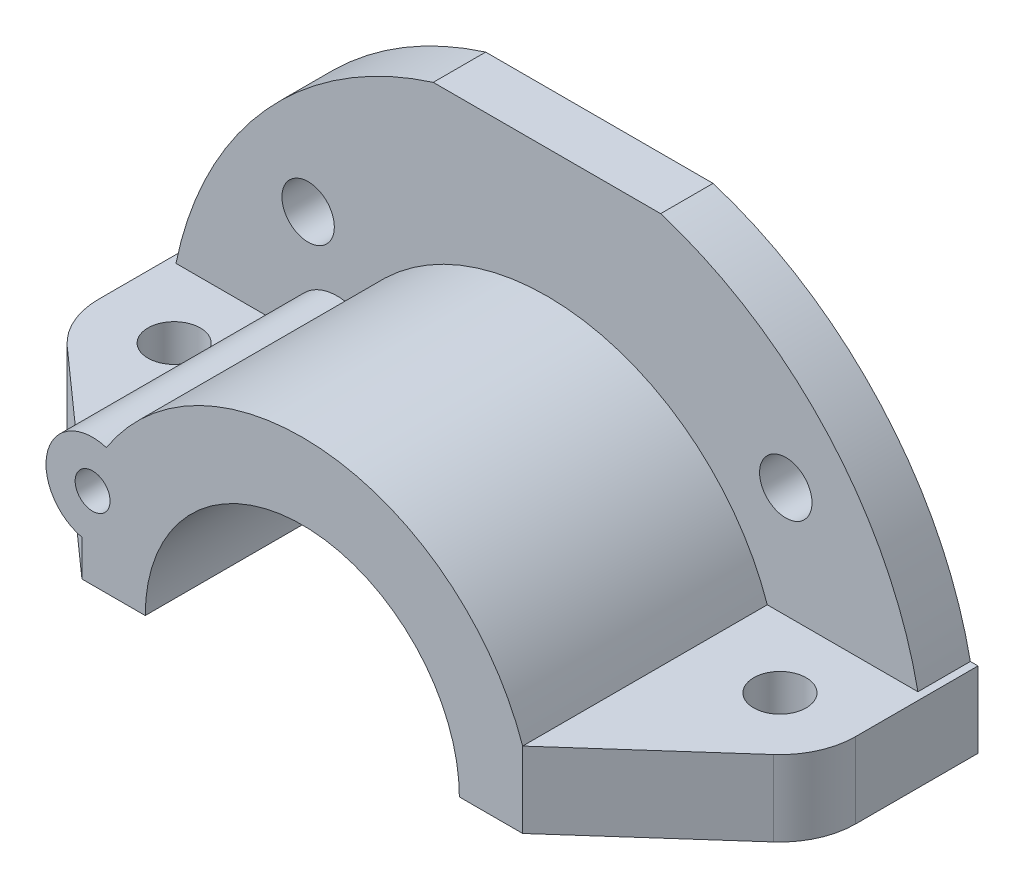
ISO-10303-21;
HEADER;
FILE_DESCRIPTION(('STEP AP214'),'2;1');
FILE_NAME('part.step','',(''),(''),'','','');
FILE_SCHEMA(('AUTOMOTIVE_DESIGN { 1 0 10303 214 1 1 1 1 }'));
ENDSEC;
DATA;
#1=APPLICATION_CONTEXT('core data for automotive mechanical design processes');
#2=APPLICATION_PROTOCOL_DEFINITION('international standard','automotive_design',2000,#1);
#3=PRODUCT_CONTEXT('',#1,'mechanical');
#4=PRODUCT('Part','Part','',(#3));
#5=PRODUCT_RELATED_PRODUCT_CATEGORY('part','',(#4));
#6=PRODUCT_DEFINITION_FORMATION('','',#4);
#7=PRODUCT_DEFINITION_CONTEXT('part definition',#1,'design');
#8=PRODUCT_DEFINITION('design','',#6,#7);
#9=PRODUCT_DEFINITION_SHAPE('','',#8);
#10=(LENGTH_UNIT() NAMED_UNIT(*) SI_UNIT(.MILLI.,.METRE.));
#11=(NAMED_UNIT(*) PLANE_ANGLE_UNIT() SI_UNIT($,.RADIAN.));
#12=(NAMED_UNIT(*) SI_UNIT($,.STERADIAN.) SOLID_ANGLE_UNIT());
#13=UNCERTAINTY_MEASURE_WITH_UNIT(LENGTH_MEASURE(1.E-05),#10,'distance_accuracy_value','');
#14=(GEOMETRIC_REPRESENTATION_CONTEXT(3) GLOBAL_UNCERTAINTY_ASSIGNED_CONTEXT((#13)) GLOBAL_UNIT_ASSIGNED_CONTEXT((#10,
#11,#12)) REPRESENTATION_CONTEXT('',''));
#15=CARTESIAN_POINT('',(0.,0.,0.));
#16=DIRECTION('',(0.,0.,1.));
#17=DIRECTION('',(1.,0.,0.));
#18=AXIS2_PLACEMENT_3D('',#15,#16,#17);
#19=CARTESIAN_POINT('',(-65.,0.,51.));
#20=DIRECTION('',(1.,0.,0.));
#21=DIRECTION('',(0.,1.,0.));
#22=AXIS2_PLACEMENT_3D('',#19,#20,#21);
#23=PLANE('',#22);
#24=DIRECTION('',(0.,1.,0.));
#25=VECTOR('',#24,1.);
#26=CARTESIAN_POINT('',(-65.,-0.00100000000003223,21.));
#27=LINE('',#26,#25);
#28=CARTESIAN_POINT('',(-65.,0.,21.));
#29=VERTEX_POINT('',#28);
#30=CARTESIAN_POINT('',(-65.,13.,21.));
#31=VERTEX_POINT('',#30);
#32=EDGE_CURVE('E167',#29,#31,#27,.T.);
#33=ORIENTED_EDGE('',*,*,#32,.T.);
#34=DIRECTION('',(0.,0.,-1.));
#35=VECTOR('',#34,1.);
#36=CARTESIAN_POINT('',(-65.,13.,51.));
#37=LINE('',#36,#35);
#38=CARTESIAN_POINT('',(-65.,13.,0.));
#39=VERTEX_POINT('',#38);
#40=EDGE_CURVE('E195',#31,#39,#37,.T.);
#41=ORIENTED_EDGE('',*,*,#40,.T.);
#42=DIRECTION('',(0.,-1.,0.));
#43=VECTOR('',#42,1.);
#44=CARTESIAN_POINT('',(-65.,0.,0.));
#45=LINE('',#44,#43);
#46=CARTESIAN_POINT('',(-65.,0.,0.));
#47=VERTEX_POINT('',#46);
#48=EDGE_CURVE('E193',#39,#47,#45,.T.);
#49=ORIENTED_EDGE('',*,*,#48,.T.);
#50=DIRECTION('',(0.,0.,-1.));
#51=VECTOR('',#50,1.);
#52=CARTESIAN_POINT('',(-65.,0.,51.));
#53=LINE('',#52,#51);
#54=EDGE_CURVE('E184',#29,#47,#53,.T.);
#55=ORIENTED_EDGE('',*,*,#54,.F.);
#56=EDGE_LOOP('',(#33,#41,#49,#55));
#57=FACE_BOUND('',#56,.T.);
#58=ADVANCED_FACE('F47',(#57),#23,.F.);
#59=CARTESIAN_POINT('',(65.,0.,51.));
#60=DIRECTION('',(1.,0.,0.));
#61=DIRECTION('',(0.,1.,0.));
#62=AXIS2_PLACEMENT_3D('',#59,#60,#61);
#63=PLANE('',#62);
#64=DIRECTION('',(0.,0.,-1.));
#65=VECTOR('',#64,1.);
#66=CARTESIAN_POINT('',(65.,13.,51.));
#67=LINE('',#66,#65);
#68=CARTESIAN_POINT('',(65.,13.,21.));
#69=VERTEX_POINT('',#68);
#70=CARTESIAN_POINT('',(65.,13.,0.));
#71=VERTEX_POINT('',#70);
#72=EDGE_CURVE('E254',#69,#71,#67,.T.);
#73=ORIENTED_EDGE('',*,*,#72,.F.);
#74=DIRECTION('',(0.,1.,0.));
#75=VECTOR('',#74,1.);
#76=CARTESIAN_POINT('',(65.,-0.00100000000001488,21.));
#77=LINE('',#76,#75);
#78=CARTESIAN_POINT('',(65.,0.,21.));
#79=VERTEX_POINT('',#78);
#80=EDGE_CURVE('E350',#79,#69,#77,.T.);
#81=ORIENTED_EDGE('',*,*,#80,.F.);
#82=DIRECTION('',(0.,0.,-1.));
#83=VECTOR('',#82,1.);
#84=CARTESIAN_POINT('',(65.,0.,51.));
#85=LINE('',#84,#83);
#86=CARTESIAN_POINT('',(65.,0.,0.));
#87=VERTEX_POINT('',#86);
#88=EDGE_CURVE('E251',#79,#87,#85,.T.);
#89=ORIENTED_EDGE('',*,*,#88,.T.);
#90=DIRECTION('',(0.,-1.,0.));
#91=VECTOR('',#90,1.);
#92=CARTESIAN_POINT('',(65.,0.,0.));
#93=LINE('',#92,#91);
#94=EDGE_CURVE('E245',#71,#87,#93,.T.);
#95=ORIENTED_EDGE('',*,*,#94,.F.);
#96=EDGE_LOOP('',(#73,#81,#89,#95));
#97=FACE_BOUND('',#96,.T.);
#98=ADVANCED_FACE('F438',(#97),#63,.T.);
#99=CARTESIAN_POINT('',(0.,13.,51.));
#100=DIRECTION('',(0.,1.,0.));
#101=DIRECTION('',(-1.,0.,0.));
#102=AXIS2_PLACEMENT_3D('',#99,#100,#101);
#103=PLANE('',#102);
#104=DIRECTION('',(0.,0.,1.));
#105=VECTOR('',#104,1.);
#106=CARTESIAN_POINT('',(-43.9372539331938,13.,-13.6274169979695));
#107=LINE('',#106,#105);
#108=CARTESIAN_POINT('',(-43.9372539331938,13.,9.));
#109=VERTEX_POINT('',#108);
#110=CARTESIAN_POINT('',(-43.9372539331938,13.,45.5674390370028));
#111=VERTEX_POINT('',#110);
#112=EDGE_CURVE('E71',#109,#111,#107,.T.);
#113=ORIENTED_EDGE('',*,*,#112,.F.);
#114=DIRECTION('',(1.,0.,0.));
#115=VECTOR('',#114,1.);
#116=CARTESIAN_POINT('',(0.,13.,9.));
#117=LINE('',#116,#115);
#118=CARTESIAN_POINT('',(-63.6867333123626,13.,9.));
#119=VERTEX_POINT('',#118);
#120=EDGE_CURVE('E315',#119,#109,#117,.T.);
#121=ORIENTED_EDGE('',*,*,#120,.F.);
#122=DIRECTION('',(0.,0.,-1.));
#123=VECTOR('',#122,1.);
#124=CARTESIAN_POINT('',(-63.6867333123626,13.,9.));
#125=LINE('',#124,#123);
#126=CARTESIAN_POINT('',(-63.6867333123626,13.,0.));
#127=VERTEX_POINT('',#126);
#128=EDGE_CURVE('E283',#119,#127,#125,.T.);
#129=ORIENTED_EDGE('',*,*,#128,.T.);
#130=DIRECTION('',(1.,0.,0.));
#131=VECTOR('',#130,1.);
#132=CARTESIAN_POINT('',(0.,13.,0.));
#133=LINE('',#132,#131);
#134=EDGE_CURVE('E201',#39,#127,#133,.T.);
#135=ORIENTED_EDGE('',*,*,#134,.F.);
#136=ORIENTED_EDGE('',*,*,#40,.F.);
#137=CARTESIAN_POINT('',(-52.,13.,21.));
#138=DIRECTION('',(0.,-1.,0.));
#139=DIRECTION('',(1.,0.,0.));
#140=AXIS2_PLACEMENT_3D('',#137,#138,#139);
#141=CIRCLE('',#140,13.);
#142=CARTESIAN_POINT('',(-60.6390494366874,13.,30.714258841027));
#143=VERTEX_POINT('',#142);
#144=EDGE_CURVE('E174',#143,#31,#141,.T.);
#145=ORIENTED_EDGE('',*,*,#144,.F.);
#146=DIRECTION('',(-0.747250680078999,0.,-0.66454226436057));
#147=VECTOR('',#146,1.);
#148=CARTESIAN_POINT('',(-37.8285606387555,13.,51.));
#149=LINE('',#148,#147);
#150=EDGE_CURVE('E189',#111,#143,#149,.T.);
#151=ORIENTED_EDGE('',*,*,#150,.F.);
#152=EDGE_LOOP('',(#113,#121,#129,#135,#136,#145,#151));
#153=FACE_BOUND('',#152,.T.);
#154=CARTESIAN_POINT('',(-52.,13.,21.));
#155=DIRECTION('',(0.,1.,0.));
#156=DIRECTION('',(-1.,0.,0.));
#157=AXIS2_PLACEMENT_3D('',#154,#155,#156);
#158=CIRCLE('',#157,4.5);
#159=CARTESIAN_POINT('',(-56.5,13.,21.));
#160=VERTEX_POINT('',#159);
#161=EDGE_CURVE('E337',#160,#160,#158,.T.);
#162=ORIENTED_EDGE('',*,*,#161,.F.);
#163=EDGE_LOOP('',(#162));
#164=FACE_BOUND('',#163,.T.);
#165=ADVANCED_FACE('F415',(#153,#164),#103,.T.);
#166=CARTESIAN_POINT('',(0.,13.,51.));
#167=DIRECTION('',(0.,1.,0.));
#168=DIRECTION('',(-1.,0.,0.));
#169=AXIS2_PLACEMENT_3D('',#166,#167,#168);
#170=PLANE('',#169);
#171=CARTESIAN_POINT('',(52.,13.,21.));
#172=DIRECTION('',(0.,-1.,0.));
#173=DIRECTION('',(-1.,0.,0.));
#174=AXIS2_PLACEMENT_3D('',#171,#172,#173);
#175=CIRCLE('',#174,13.);
#176=CARTESIAN_POINT('',(60.6390494366874,13.,30.714258841027));
#177=VERTEX_POINT('',#176);
#178=EDGE_CURVE('E342',#69,#177,#175,.T.);
#179=ORIENTED_EDGE('',*,*,#178,.F.);
#180=ORIENTED_EDGE('',*,*,#72,.T.);
#181=DIRECTION('',(1.,0.,0.));
#182=VECTOR('',#181,1.);
#183=CARTESIAN_POINT('',(0.,13.,0.));
#184=LINE('',#183,#182);
#185=CARTESIAN_POINT('',(63.6867333123626,13.,0.));
#186=VERTEX_POINT('',#185);
#187=EDGE_CURVE('E199',#186,#71,#184,.T.);
#188=ORIENTED_EDGE('',*,*,#187,.F.);
#189=DIRECTION('',(0.,0.,-1.));
#190=VECTOR('',#189,1.);
#191=CARTESIAN_POINT('',(63.6867333123626,13.,9.));
#192=LINE('',#191,#190);
#193=CARTESIAN_POINT('',(63.6867333123626,13.,9.));
#194=VERTEX_POINT('',#193);
#195=EDGE_CURVE('E263',#194,#186,#192,.T.);
#196=ORIENTED_EDGE('',*,*,#195,.F.);
#197=DIRECTION('',(1.,0.,0.));
#198=VECTOR('',#197,1.);
#199=CARTESIAN_POINT('',(0.,13.,9.));
#200=LINE('',#199,#198);
#201=CARTESIAN_POINT('',(37.8285606387555,13.,9.));
#202=VERTEX_POINT('',#201);
#203=EDGE_CURVE('E325',#202,#194,#200,.T.);
#204=ORIENTED_EDGE('',*,*,#203,.F.);
#205=DIRECTION('',(0.,0.,-1.));
#206=VECTOR('',#205,1.);
#207=CARTESIAN_POINT('',(37.8285606387555,13.,51.));
#208=LINE('',#207,#206);
#209=CARTESIAN_POINT('',(37.8285606387555,13.,51.));
#210=VERTEX_POINT('',#209);
#211=EDGE_CURVE('E223',#210,#202,#208,.T.);
#212=ORIENTED_EDGE('',*,*,#211,.F.);
#213=DIRECTION('',(-0.747250680078998,0.,0.664542264360571));
#214=VECTOR('',#213,1.);
#215=CARTESIAN_POINT('',(37.8285606387555,13.,51.));
#216=LINE('',#215,#214);
#217=EDGE_CURVE('E346',#177,#210,#216,.T.);
#218=ORIENTED_EDGE('',*,*,#217,.F.);
#219=EDGE_LOOP('',(#179,#180,#188,#196,#204,#212,#218));
#220=FACE_BOUND('',#219,.T.);
#221=CARTESIAN_POINT('',(52.,13.,21.));
#222=DIRECTION('',(0.,1.,0.));
#223=DIRECTION('',(-1.,0.,0.));
#224=AXIS2_PLACEMENT_3D('',#221,#222,#223);
#225=CIRCLE('',#224,4.5);
#226=CARTESIAN_POINT('',(47.5,13.,21.));
#227=VERTEX_POINT('',#226);
#228=EDGE_CURVE('E333',#227,#227,#225,.T.);
#229=ORIENTED_EDGE('',*,*,#228,.F.);
#230=EDGE_LOOP('',(#229));
#231=FACE_BOUND('',#230,.T.);
#232=ADVANCED_FACE('F432',(#220,#231),#170,.T.);
#233=CARTESIAN_POINT('',(0.,0.,51.));
#234=DIRECTION('',(0.,0.,-1.));
#235=DIRECTION('',(-1.,0.,0.));
#236=AXIS2_PLACEMENT_3D('',#233,#234,#235);
#237=CYLINDRICAL_SURFACE('',#236,26.965);
#238=CARTESIAN_POINT('',(0.,0.,0.));
#239=DIRECTION('',(0.,0.,1.));
#240=DIRECTION('',(1.,0.,0.));
#241=AXIS2_PLACEMENT_3D('',#238,#239,#240);
#242=CIRCLE('',#241,26.965);
#243=CARTESIAN_POINT('',(26.965,0.,0.));
#244=VERTEX_POINT('',#243);
#245=CARTESIAN_POINT('',(-26.965,0.,0.));
#246=VERTEX_POINT('',#245);
#247=EDGE_CURVE('E218',#244,#246,#242,.T.);
#248=ORIENTED_EDGE('',*,*,#247,.F.);
#249=DIRECTION('',(0.,0.,-1.));
#250=VECTOR('',#249,1.);
#251=CARTESIAN_POINT('',(26.965,0.,51.));
#252=LINE('',#251,#250);
#253=CARTESIAN_POINT('',(26.965,0.,51.));
#254=VERTEX_POINT('',#253);
#255=EDGE_CURVE('E56',#254,#244,#252,.T.);
#256=ORIENTED_EDGE('',*,*,#255,.F.);
#257=CARTESIAN_POINT('',(0.,0.,51.));
#258=DIRECTION('',(0.,0.,1.));
#259=DIRECTION('',(1.,0.,0.));
#260=AXIS2_PLACEMENT_3D('',#257,#258,#259);
#261=CIRCLE('',#260,26.965);
#262=CARTESIAN_POINT('',(-26.965,0.,51.));
#263=VERTEX_POINT('',#262);
#264=EDGE_CURVE('E205',#254,#263,#261,.T.);
#265=ORIENTED_EDGE('',*,*,#264,.T.);
#266=DIRECTION('',(0.,0.,-1.));
#267=VECTOR('',#266,1.);
#268=CARTESIAN_POINT('',(-26.965,0.,51.));
#269=LINE('',#268,#267);
#270=EDGE_CURVE('E227',#263,#246,#269,.T.);
#271=ORIENTED_EDGE('',*,*,#270,.T.);
#272=EDGE_LOOP('',(#248,#256,#265,#271));
#273=FACE_BOUND('',#272,.T.);
#274=ADVANCED_FACE('F49',(#273),#237,.F.);
#275=CARTESIAN_POINT('',(0.,0.,51.));
#276=DIRECTION('',(0.,1.,0.));
#277=DIRECTION('',(-1.,0.,0.));
#278=AXIS2_PLACEMENT_3D('',#275,#276,#277);
#279=PLANE('',#278);
#280=CARTESIAN_POINT('',(52.,0.,21.));
#281=DIRECTION('',(0.,1.,0.));
#282=DIRECTION('',(-1.,0.,0.));
#283=AXIS2_PLACEMENT_3D('',#280,#281,#282);
#284=CIRCLE('',#283,4.5);
#285=CARTESIAN_POINT('',(47.5,0.,21.));
#286=VERTEX_POINT('',#285);
#287=EDGE_CURVE('E307',#286,#286,#284,.F.);
#288=ORIENTED_EDGE('',*,*,#287,.F.);
#289=EDGE_LOOP('',(#288));
#290=FACE_BOUND('',#289,.T.);
#291=ORIENTED_EDGE('',*,*,#88,.F.);
#292=CARTESIAN_POINT('',(52.,0.,21.));
#293=DIRECTION('',(0.,1.,0.));
#294=DIRECTION('',(-1.,0.,0.));
#295=AXIS2_PLACEMENT_3D('',#292,#293,#294);
#296=CIRCLE('',#295,13.);
#297=CARTESIAN_POINT('',(60.6390494366874,0.,30.714258841027));
#298=VERTEX_POINT('',#297);
#299=EDGE_CURVE('E338',#298,#79,#296,.T.);
#300=ORIENTED_EDGE('',*,*,#299,.F.);
#301=DIRECTION('',(0.747250680078998,0.,-0.664542264360571));
#302=VECTOR('',#301,1.);
#303=CARTESIAN_POINT('',(37.8285606387555,0.,51.));
#304=LINE('',#303,#302);
#305=CARTESIAN_POINT('',(37.8285606387555,0.,51.));
#306=VERTEX_POINT('',#305);
#307=EDGE_CURVE('E354',#306,#298,#304,.T.);
#308=ORIENTED_EDGE('',*,*,#307,.F.);
#309=DIRECTION('',(1.,0.,0.));
#310=VECTOR('',#309,1.);
#311=CARTESIAN_POINT('',(0.,0.,51.));
#312=LINE('',#311,#310);
#313=EDGE_CURVE('E209',#254,#306,#312,.T.);
#314=ORIENTED_EDGE('',*,*,#313,.F.);
#315=ORIENTED_EDGE('',*,*,#255,.T.);
#316=DIRECTION('',(1.,0.,0.));
#317=VECTOR('',#316,1.);
#318=CARTESIAN_POINT('',(0.,0.,0.));
#319=LINE('',#318,#317);
#320=EDGE_CURVE('E222',#244,#87,#319,.T.);
#321=ORIENTED_EDGE('',*,*,#320,.T.);
#322=EDGE_LOOP('',(#291,#300,#308,#314,#315,#321));
#323=FACE_BOUND('',#322,.T.);
#324=ADVANCED_FACE('F234',(#290,#323),#279,.F.);
#325=CARTESIAN_POINT('',(0.,0.,51.));
#326=DIRECTION('',(0.,0.,-1.));
#327=DIRECTION('',(-1.,0.,0.));
#328=AXIS2_PLACEMENT_3D('',#325,#326,#327);
#329=CYLINDRICAL_SURFACE('',#328,40.);
#330=CARTESIAN_POINT('',(0.,0.,9.));
#331=DIRECTION('',(0.,0.,1.));
#332=DIRECTION('',(1.,0.,0.));
#333=AXIS2_PLACEMENT_3D('',#330,#331,#332);
#334=CIRCLE('',#333,40.);
#335=CARTESIAN_POINT('',(-33.6386188705644,21.6435514756915,9.));
#336=VERTEX_POINT('',#335);
#337=EDGE_CURVE('E294',#202,#336,#334,.T.);
#338=ORIENTED_EDGE('',*,*,#337,.T.);
#339=DIRECTION('',(0.,0.,1.));
#340=VECTOR('',#339,1.);
#341=CARTESIAN_POINT('',(-33.6386188705644,21.6435514756915,30.));
#342=LINE('',#341,#340);
#343=CARTESIAN_POINT('',(-33.6386188705644,21.6435514756915,51.));
#344=VERTEX_POINT('',#343);
#345=EDGE_CURVE('E63',#336,#344,#342,.T.);
#346=ORIENTED_EDGE('',*,*,#345,.T.);
#347=CARTESIAN_POINT('',(0.,0.,51.));
#348=DIRECTION('',(0.,0.,1.));
#349=DIRECTION('',(1.,0.,0.));
#350=AXIS2_PLACEMENT_3D('',#347,#348,#349);
#351=CIRCLE('',#350,40.);
#352=EDGE_CURVE('E214',#210,#344,#351,.T.);
#353=ORIENTED_EDGE('',*,*,#352,.F.);
#354=ORIENTED_EDGE('',*,*,#211,.T.);
#355=EDGE_LOOP('',(#338,#346,#353,#354));
#356=FACE_BOUND('',#355,.T.);
#357=ADVANCED_FACE('F444',(#356),#329,.T.);
#358=CARTESIAN_POINT('',(-52.,0.,21.));
#359=DIRECTION('',(0.,1.,0.));
#360=DIRECTION('',(-1.,0.,0.));
#361=AXIS2_PLACEMENT_3D('',#358,#359,#360);
#362=CIRCLE('',#361,4.5);
#363=CARTESIAN_POINT('',(-56.5,0.,21.));
#364=VERTEX_POINT('',#363);
#365=EDGE_CURVE('E341',#364,#364,#362,.F.);
#366=ORIENTED_EDGE('',*,*,#365,.F.);
#367=EDGE_LOOP('',(#366));
#368=FACE_BOUND('',#367,.T.);
#369=DIRECTION('',(0.747250680078999,0.,0.66454226436057));
#370=VECTOR('',#369,1.);
#371=CARTESIAN_POINT('',(-37.8285606387555,0.,51.));
#372=LINE('',#371,#370);
#373=CARTESIAN_POINT('',(-60.6390494366874,0.,30.714258841027));
#374=VERTEX_POINT('',#373);
#375=CARTESIAN_POINT('',(-37.8285606387555,0.,51.));
#376=VERTEX_POINT('',#375);
#377=EDGE_CURVE('E187',#374,#376,#372,.T.);
#378=ORIENTED_EDGE('',*,*,#377,.F.);
#379=CARTESIAN_POINT('',(-52.,0.,21.));
#380=DIRECTION('',(0.,1.,0.));
#381=DIRECTION('',(-1.,0.,0.));
#382=AXIS2_PLACEMENT_3D('',#379,#380,#381);
#383=CIRCLE('',#382,13.);
#384=EDGE_CURVE('E171',#29,#374,#383,.T.);
#385=ORIENTED_EDGE('',*,*,#384,.F.);
#386=ORIENTED_EDGE('',*,*,#54,.T.);
#387=EDGE_CURVE('E210',#47,#246,#319,.T.);
#388=ORIENTED_EDGE('',*,*,#387,.T.);
#389=ORIENTED_EDGE('',*,*,#270,.F.);
#390=EDGE_CURVE('E215',#376,#263,#312,.T.);
#391=ORIENTED_EDGE('',*,*,#390,.F.);
#392=EDGE_LOOP('',(#378,#385,#386,#388,#389,#391));
#393=FACE_BOUND('',#392,.T.);
#394=ADVANCED_FACE('F182',(#368,#393),#279,.F.);
#395=CARTESIAN_POINT('',(0.,0.,51.));
#396=DIRECTION('',(0.,0.,1.));
#397=DIRECTION('',(1.,0.,0.));
#398=AXIS2_PLACEMENT_3D('',#395,#396,#397);
#399=PLANE('',#398);
#400=CARTESIAN_POINT('',(-36.,14.,51.));
#401=DIRECTION('',(0.,0.,1.));
#402=DIRECTION('',(1.,0.,0.));
#403=AXIS2_PLACEMENT_3D('',#400,#401,#402);
#404=CIRCLE('',#403,3.);
#405=CARTESIAN_POINT('',(-33.,14.,51.));
#406=VERTEX_POINT('',#405);
#407=EDGE_CURVE('E395',#406,#406,#404,.T.);
#408=ORIENTED_EDGE('',*,*,#407,.F.);
#409=EDGE_LOOP('',(#408));
#410=FACE_BOUND('',#409,.T.);
#411=ORIENTED_EDGE('',*,*,#352,.T.);
#412=CARTESIAN_POINT('',(-36.,14.,51.));
#413=DIRECTION('',(0.,0.,1.));
#414=DIRECTION('',(1.,0.,0.));
#415=AXIS2_PLACEMENT_3D('',#412,#413,#414);
#416=CIRCLE('',#415,8.);
#417=CARTESIAN_POINT('',(-37.8285606387555,6.21178030674568,51.));
#418=VERTEX_POINT('',#417);
#419=EDGE_CURVE('E387',#344,#418,#416,.T.);
#420=ORIENTED_EDGE('',*,*,#419,.T.);
#421=DIRECTION('',(0.,1.,0.));
#422=VECTOR('',#421,1.);
#423=CARTESIAN_POINT('',(-37.8285606387555,-0.00100000000002876,51.));
#424=LINE('',#423,#422);
#425=EDGE_CURVE('E374',#376,#418,#424,.T.);
#426=ORIENTED_EDGE('',*,*,#425,.F.);
#427=ORIENTED_EDGE('',*,*,#390,.T.);
#428=ORIENTED_EDGE('',*,*,#264,.F.);
#429=ORIENTED_EDGE('',*,*,#313,.T.);
#430=DIRECTION('',(0.,1.,0.));
#431=VECTOR('',#430,1.);
#432=CARTESIAN_POINT('',(37.8285606387555,-0.00100000000001835,51.));
#433=LINE('',#432,#431);
#434=EDGE_CURVE('E353',#306,#210,#433,.T.);
#435=ORIENTED_EDGE('',*,*,#434,.T.);
#436=EDGE_LOOP('',(#411,#420,#426,#427,#428,#429,#435));
#437=FACE_BOUND('',#436,.T.);
#438=ADVANCED_FACE('F402',(#410,#437),#399,.T.);
#439=CARTESIAN_POINT('',(0.,0.,0.));
#440=DIRECTION('',(0.,0.,1.));
#441=DIRECTION('',(1.,0.,0.));
#442=AXIS2_PLACEMENT_3D('',#439,#440,#441);
#443=PLANE('',#442);
#444=ORIENTED_EDGE('',*,*,#247,.T.);
#445=ORIENTED_EDGE('',*,*,#387,.F.);
#446=ORIENTED_EDGE('',*,*,#48,.F.);
#447=ORIENTED_EDGE('',*,*,#134,.T.);
#448=CARTESIAN_POINT('',(0.,0.,0.));
#449=DIRECTION('',(0.,0.,1.));
#450=DIRECTION('',(1.,0.,0.));
#451=AXIS2_PLACEMENT_3D('',#448,#449,#450);
#452=CIRCLE('',#451,65.);
#453=CARTESIAN_POINT('',(-19.5192212959432,62.,0.));
#454=VERTEX_POINT('',#453);
#455=EDGE_CURVE('E299',#454,#127,#452,.T.);
#456=ORIENTED_EDGE('',*,*,#455,.F.);
#457=DIRECTION('',(1.,0.,0.));
#458=VECTOR('',#457,1.);
#459=CARTESIAN_POINT('',(0.,62.,0.));
#460=LINE('',#459,#458);
#461=CARTESIAN_POINT('',(19.5192212959432,62.,0.));
#462=VERTEX_POINT('',#461);
#463=EDGE_CURVE('E300',#454,#462,#460,.T.);
#464=ORIENTED_EDGE('',*,*,#463,.T.);
#465=EDGE_CURVE('E304',#186,#462,#452,.T.);
#466=ORIENTED_EDGE('',*,*,#465,.F.);
#467=ORIENTED_EDGE('',*,*,#187,.T.);
#468=ORIENTED_EDGE('',*,*,#94,.T.);
#469=ORIENTED_EDGE('',*,*,#320,.F.);
#470=EDGE_LOOP('',(#444,#445,#446,#447,#456,#464,#466,#467,#468,#469));
#471=FACE_BOUND('',#470,.T.);
#472=CARTESIAN_POINT('',(-41.,32.,0.));
#473=DIRECTION('',(0.,0.,1.));
#474=DIRECTION('',(1.,0.,0.));
#475=AXIS2_PLACEMENT_3D('',#472,#473,#474);
#476=CIRCLE('',#475,4.5);
#477=CARTESIAN_POINT('',(-36.5,32.,0.));
#478=VERTEX_POINT('',#477);
#479=EDGE_CURVE('E295',#478,#478,#476,.T.);
#480=ORIENTED_EDGE('',*,*,#479,.T.);
#481=EDGE_LOOP('',(#480));
#482=FACE_BOUND('',#481,.T.);
#483=CARTESIAN_POINT('',(41.,32.,0.));
#484=DIRECTION('',(0.,0.,1.));
#485=DIRECTION('',(1.,0.,0.));
#486=AXIS2_PLACEMENT_3D('',#483,#484,#485);
#487=CIRCLE('',#486,4.5);
#488=CARTESIAN_POINT('',(45.5,32.,0.));
#489=VERTEX_POINT('',#488);
#490=EDGE_CURVE('E290',#489,#489,#487,.F.);
#491=ORIENTED_EDGE('',*,*,#490,.F.);
#492=EDGE_LOOP('',(#491));
#493=FACE_BOUND('',#492,.T.);
#494=ADVANCED_FACE('F241',(#471,#482,#493),#443,.F.);
#495=CARTESIAN_POINT('',(0.,0.,9.));
#496=DIRECTION('',(0.,0.,-1.));
#497=DIRECTION('',(-1.,0.,0.));
#498=AXIS2_PLACEMENT_3D('',#495,#496,#497);
#499=CYLINDRICAL_SURFACE('',#498,65.);
#500=ORIENTED_EDGE('',*,*,#465,.T.);
#501=DIRECTION('',(0.,0.,-1.));
#502=VECTOR('',#501,1.);
#503=CARTESIAN_POINT('',(19.5192212959432,62.,9.));
#504=LINE('',#503,#502);
#505=CARTESIAN_POINT('',(19.5192212959432,62.,9.));
#506=VERTEX_POINT('',#505);
#507=EDGE_CURVE('E271',#506,#462,#504,.T.);
#508=ORIENTED_EDGE('',*,*,#507,.F.);
#509=CARTESIAN_POINT('',(0.,0.,9.));
#510=DIRECTION('',(0.,0.,1.));
#511=DIRECTION('',(1.,0.,0.));
#512=AXIS2_PLACEMENT_3D('',#509,#510,#511);
#513=CIRCLE('',#512,65.);
#514=EDGE_CURVE('E322',#194,#506,#513,.T.);
#515=ORIENTED_EDGE('',*,*,#514,.F.);
#516=ORIENTED_EDGE('',*,*,#195,.T.);
#517=EDGE_LOOP('',(#500,#508,#515,#516));
#518=FACE_BOUND('',#517,.T.);
#519=ADVANCED_FACE('F428',(#518),#499,.T.);
#520=CARTESIAN_POINT('',(0.,62.,9.));
#521=DIRECTION('',(0.,1.,0.));
#522=DIRECTION('',(0.,0.,1.));
#523=AXIS2_PLACEMENT_3D('',#520,#521,#522);
#524=PLANE('',#523);
#525=ORIENTED_EDGE('',*,*,#463,.F.);
#526=DIRECTION('',(0.,0.,-1.));
#527=VECTOR('',#526,1.);
#528=CARTESIAN_POINT('',(-19.5192212959432,62.,9.));
#529=LINE('',#528,#527);
#530=CARTESIAN_POINT('',(-19.5192212959432,62.,9.));
#531=VERTEX_POINT('',#530);
#532=EDGE_CURVE('E277',#531,#454,#529,.T.);
#533=ORIENTED_EDGE('',*,*,#532,.F.);
#534=DIRECTION('',(1.,0.,0.));
#535=VECTOR('',#534,1.);
#536=CARTESIAN_POINT('',(0.,62.,9.));
#537=LINE('',#536,#535);
#538=EDGE_CURVE('E319',#531,#506,#537,.T.);
#539=ORIENTED_EDGE('',*,*,#538,.T.);
#540=ORIENTED_EDGE('',*,*,#507,.T.);
#541=EDGE_LOOP('',(#525,#533,#539,#540));
#542=FACE_BOUND('',#541,.T.);
#543=ADVANCED_FACE('F427',(#542),#524,.T.);
#544=ORIENTED_EDGE('',*,*,#455,.T.);
#545=ORIENTED_EDGE('',*,*,#128,.F.);
#546=EDGE_CURVE('E318',#531,#119,#513,.T.);
#547=ORIENTED_EDGE('',*,*,#546,.F.);
#548=ORIENTED_EDGE('',*,*,#532,.T.);
#549=EDGE_LOOP('',(#544,#545,#547,#548));
#550=FACE_BOUND('',#549,.T.);
#551=ADVANCED_FACE('F420',(#550),#499,.T.);
#552=CARTESIAN_POINT('',(-41.,32.,9.));
#553=DIRECTION('',(0.,0.,-1.));
#554=DIRECTION('',(-1.,0.,0.));
#555=AXIS2_PLACEMENT_3D('',#552,#553,#554);
#556=CYLINDRICAL_SURFACE('',#555,4.5);
#557=CARTESIAN_POINT('',(-41.,32.,9.));
#558=DIRECTION('',(0.,0.,1.));
#559=DIRECTION('',(1.,0.,0.));
#560=AXIS2_PLACEMENT_3D('',#557,#558,#559);
#561=CIRCLE('',#560,4.5);
#562=CARTESIAN_POINT('',(-36.5,32.,9.));
#563=VERTEX_POINT('',#562);
#564=EDGE_CURVE('E311',#563,#563,#561,.T.);
#565=ORIENTED_EDGE('',*,*,#564,.T.);
#566=EDGE_LOOP('',(#565));
#567=FACE_BOUND('',#566,.T.);
#568=ORIENTED_EDGE('',*,*,#479,.F.);
#569=EDGE_LOOP('',(#568));
#570=FACE_BOUND('',#569,.T.);
#571=ADVANCED_FACE('F477',(#567,#570),#556,.F.);
#572=CARTESIAN_POINT('',(41.,32.,9.));
#573=DIRECTION('',(0.,0.,-1.));
#574=DIRECTION('',(-1.,0.,0.));
#575=AXIS2_PLACEMENT_3D('',#572,#573,#574);
#576=CYLINDRICAL_SURFACE('',#575,4.5);
#577=CARTESIAN_POINT('',(41.,32.,9.));
#578=DIRECTION('',(0.,0.,1.));
#579=DIRECTION('',(1.,0.,0.));
#580=AXIS2_PLACEMENT_3D('',#577,#578,#579);
#581=CIRCLE('',#580,4.5);
#582=CARTESIAN_POINT('',(45.5,32.,9.));
#583=VERTEX_POINT('',#582);
#584=EDGE_CURVE('E289',#583,#583,#581,.F.);
#585=ORIENTED_EDGE('',*,*,#584,.F.);
#586=EDGE_LOOP('',(#585));
#587=FACE_BOUND('',#586,.T.);
#588=ORIENTED_EDGE('',*,*,#490,.T.);
#589=EDGE_LOOP('',(#588));
#590=FACE_BOUND('',#589,.T.);
#591=ADVANCED_FACE('F481',(#587,#590),#576,.F.);
#592=CARTESIAN_POINT('',(0.,0.,9.));
#593=DIRECTION('',(0.,0.,1.));
#594=DIRECTION('',(1.,0.,0.));
#595=AXIS2_PLACEMENT_3D('',#592,#593,#594);
#596=PLANE('',#595);
#597=CARTESIAN_POINT('',(-36.,14.,9.));
#598=DIRECTION('',(0.,0.,1.));
#599=DIRECTION('',(1.,0.,0.));
#600=AXIS2_PLACEMENT_3D('',#597,#598,#599);
#601=CIRCLE('',#600,8.);
#602=EDGE_CURVE('E384',#109,#336,#601,.F.);
#603=ORIENTED_EDGE('',*,*,#602,.T.);
#604=ORIENTED_EDGE('',*,*,#337,.F.);
#605=ORIENTED_EDGE('',*,*,#203,.T.);
#606=ORIENTED_EDGE('',*,*,#514,.T.);
#607=ORIENTED_EDGE('',*,*,#538,.F.);
#608=ORIENTED_EDGE('',*,*,#546,.T.);
#609=ORIENTED_EDGE('',*,*,#120,.T.);
#610=EDGE_LOOP('',(#603,#604,#605,#606,#607,#608,#609));
#611=FACE_BOUND('',#610,.T.);
#612=ORIENTED_EDGE('',*,*,#564,.F.);
#613=EDGE_LOOP('',(#612));
#614=FACE_BOUND('',#613,.T.);
#615=ORIENTED_EDGE('',*,*,#584,.T.);
#616=EDGE_LOOP('',(#615));
#617=FACE_BOUND('',#616,.T.);
#618=ADVANCED_FACE('F425',(#611,#614,#617),#596,.T.);
#619=CARTESIAN_POINT('',(52.,-0.00100000000001661,21.));
#620=DIRECTION('',(0.,1.,0.));
#621=DIRECTION('',(-1.,0.,0.));
#622=AXIS2_PLACEMENT_3D('',#619,#620,#621);
#623=CYLINDRICAL_SURFACE('',#622,13.);
#624=ORIENTED_EDGE('',*,*,#299,.T.);
#625=ORIENTED_EDGE('',*,*,#80,.T.);
#626=ORIENTED_EDGE('',*,*,#178,.T.);
#627=DIRECTION('',(0.,1.,0.));
#628=VECTOR('',#627,1.);
#629=CARTESIAN_POINT('',(60.6390494366874,-0.00100000000001661,30.714258841027));
#630=LINE('',#629,#628);
#631=EDGE_CURVE('E349',#298,#177,#630,.T.);
#632=ORIENTED_EDGE('',*,*,#631,.F.);
#633=EDGE_LOOP('',(#624,#625,#626,#632));
#634=FACE_BOUND('',#633,.T.);
#635=ADVANCED_FACE('F441',(#634),#623,.T.);
#636=CARTESIAN_POINT('',(37.8285606387555,-0.00100000000001835,51.));
#637=DIRECTION('',(-0.664542264360571,0.,-0.747250680078998));
#638=DIRECTION('',(-0.747250680078998,0.,0.664542264360571));
#639=AXIS2_PLACEMENT_3D('',#636,#637,#638);
#640=PLANE('',#639);
#641=ORIENTED_EDGE('',*,*,#307,.T.);
#642=ORIENTED_EDGE('',*,*,#631,.T.);
#643=ORIENTED_EDGE('',*,*,#217,.T.);
#644=ORIENTED_EDGE('',*,*,#434,.F.);
#645=EDGE_LOOP('',(#641,#642,#643,#644));
#646=FACE_BOUND('',#645,.T.);
#647=ADVANCED_FACE('F443',(#646),#640,.F.);
#648=CARTESIAN_POINT('',(-52.,-0.00100000000003049,21.));
#649=DIRECTION('',(0.,1.,0.));
#650=DIRECTION('',(-1.,0.,0.));
#651=AXIS2_PLACEMENT_3D('',#648,#649,#650);
#652=CYLINDRICAL_SURFACE('',#651,13.);
#653=ORIENTED_EDGE('',*,*,#384,.T.);
#654=DIRECTION('',(0.,1.,0.));
#655=VECTOR('',#654,1.);
#656=CARTESIAN_POINT('',(-60.6390494366874,-0.00100000000003049,30.714258841027));
#657=LINE('',#656,#655);
#658=EDGE_CURVE('E179',#374,#143,#657,.T.);
#659=ORIENTED_EDGE('',*,*,#658,.T.);
#660=ORIENTED_EDGE('',*,*,#144,.T.);
#661=ORIENTED_EDGE('',*,*,#32,.F.);
#662=EDGE_LOOP('',(#653,#659,#660,#661));
#663=FACE_BOUND('',#662,.T.);
#664=ADVANCED_FACE('F169',(#663),#652,.T.);
#665=CARTESIAN_POINT('',(-37.8285606387555,-0.00100000000002876,51.));
#666=DIRECTION('',(0.66454226436057,0.,-0.747250680078999));
#667=DIRECTION('',(-0.747250680078999,0.,-0.66454226436057));
#668=AXIS2_PLACEMENT_3D('',#665,#666,#667);
#669=PLANE('',#668);
#670=ORIENTED_EDGE('',*,*,#425,.T.);
#671=CARTESIAN_POINT('',(-36.,14.,52.6261689146549));
#672=DIRECTION('',(0.66454226436057,0.,-0.747250680078999));
#673=DIRECTION('',(0.747250680078999,0.,0.66454226436057));
#674=AXIS2_PLACEMENT_3D('',#671,#672,#673);
#675=ELLIPSE('',#674,10.7059119693999,8.);
#676=EDGE_CURVE('E11',#418,#111,#675,.T.);
#677=ORIENTED_EDGE('',*,*,#676,.T.);
#678=ORIENTED_EDGE('',*,*,#150,.T.);
#679=ORIENTED_EDGE('',*,*,#658,.F.);
#680=ORIENTED_EDGE('',*,*,#377,.T.);
#681=EDGE_LOOP('',(#670,#677,#678,#679,#680));
#682=FACE_BOUND('',#681,.T.);
#683=ADVANCED_FACE('F414',(#682),#669,.F.);
#684=CARTESIAN_POINT('',(-52.,-0.00100000000003049,21.));
#685=DIRECTION('',(0.,1.,0.));
#686=DIRECTION('',(-1.,0.,0.));
#687=AXIS2_PLACEMENT_3D('',#684,#685,#686);
#688=CYLINDRICAL_SURFACE('',#687,4.5);
#689=ORIENTED_EDGE('',*,*,#161,.T.);
#690=EDGE_LOOP('',(#689));
#691=FACE_BOUND('',#690,.T.);
#692=ORIENTED_EDGE('',*,*,#365,.T.);
#693=EDGE_LOOP('',(#692));
#694=FACE_BOUND('',#693,.T.);
#695=ADVANCED_FACE('F493',(#691,#694),#688,.F.);
#696=CARTESIAN_POINT('',(52.,-0.00100000000001661,21.));
#697=DIRECTION('',(0.,1.,0.));
#698=DIRECTION('',(-1.,0.,0.));
#699=AXIS2_PLACEMENT_3D('',#696,#697,#698);
#700=CYLINDRICAL_SURFACE('',#699,4.5);
#701=ORIENTED_EDGE('',*,*,#228,.T.);
#702=EDGE_LOOP('',(#701));
#703=FACE_BOUND('',#702,.T.);
#704=ORIENTED_EDGE('',*,*,#287,.T.);
#705=EDGE_LOOP('',(#704));
#706=FACE_BOUND('',#705,.T.);
#707=ADVANCED_FACE('F490',(#703,#706),#700,.F.);
#708=CARTESIAN_POINT('',(-36.,14.,-13.6274169979695));
#709=DIRECTION('',(0.,0.,1.));
#710=DIRECTION('',(1.,0.,0.));
#711=AXIS2_PLACEMENT_3D('',#708,#709,#710);
#712=CYLINDRICAL_SURFACE('',#711,8.);
#713=ORIENTED_EDGE('',*,*,#345,.F.);
#714=ORIENTED_EDGE('',*,*,#602,.F.);
#715=ORIENTED_EDGE('',*,*,#112,.T.);
#716=ORIENTED_EDGE('',*,*,#676,.F.);
#717=ORIENTED_EDGE('',*,*,#419,.F.);
#718=EDGE_LOOP('',(#713,#714,#715,#716,#717));
#719=FACE_BOUND('',#718,.T.);
#720=ADVANCED_FACE('F411',(#719),#712,.T.);
#721=CARTESIAN_POINT('',(-36.,14.,38.));
#722=DIRECTION('',(0.,0.,-1.));
#723=DIRECTION('',(-1.,0.,0.));
#724=AXIS2_PLACEMENT_3D('',#721,#722,#723);
#725=PLANE('',#724);
#726=CARTESIAN_POINT('',(-36.,14.,38.));
#727=DIRECTION('',(0.,0.,1.));
#728=DIRECTION('',(1.,0.,0.));
#729=AXIS2_PLACEMENT_3D('',#726,#727,#728);
#730=CIRCLE('',#729,3.);
#731=CARTESIAN_POINT('',(-33.,14.,38.));
#732=VERTEX_POINT('',#731);
#733=EDGE_CURVE('E391',#732,#732,#730,.T.);
#734=ORIENTED_EDGE('',*,*,#733,.T.);
#735=EDGE_LOOP('',(#734));
#736=FACE_BOUND('',#735,.T.);
#737=ADVANCED_FACE('F508',(#736),#725,.F.);
#738=CARTESIAN_POINT('',(-36.,14.,51.));
#739=DIRECTION('',(0.,0.,1.));
#740=DIRECTION('',(1.,0.,0.));
#741=AXIS2_PLACEMENT_3D('',#738,#739,#740);
#742=CYLINDRICAL_SURFACE('',#741,3.);
#743=ORIENTED_EDGE('',*,*,#733,.F.);
#744=EDGE_LOOP('',(#743));
#745=FACE_BOUND('',#744,.T.);
#746=ORIENTED_EDGE('',*,*,#407,.T.);
#747=EDGE_LOOP('',(#746));
#748=FACE_BOUND('',#747,.T.);
#749=ADVANCED_FACE('F400',(#745,#748),#742,.F.);
#750=CLOSED_SHELL('',(#58,#98,#165,#232,#274,#324,#357,#394,#438,#494,#519,#543,#551,#571,#591,
#618,#635,#647,#664,#683,#695,#707,#720,#737,#749));
#751=MANIFOLD_SOLID_BREP('B2',#750);
#752=ADVANCED_BREP_SHAPE_REPRESENTATION('',(#18,#751),#14);
#753=SHAPE_DEFINITION_REPRESENTATION(#9,#752);
ENDSEC;
END-ISO-10303-21;
